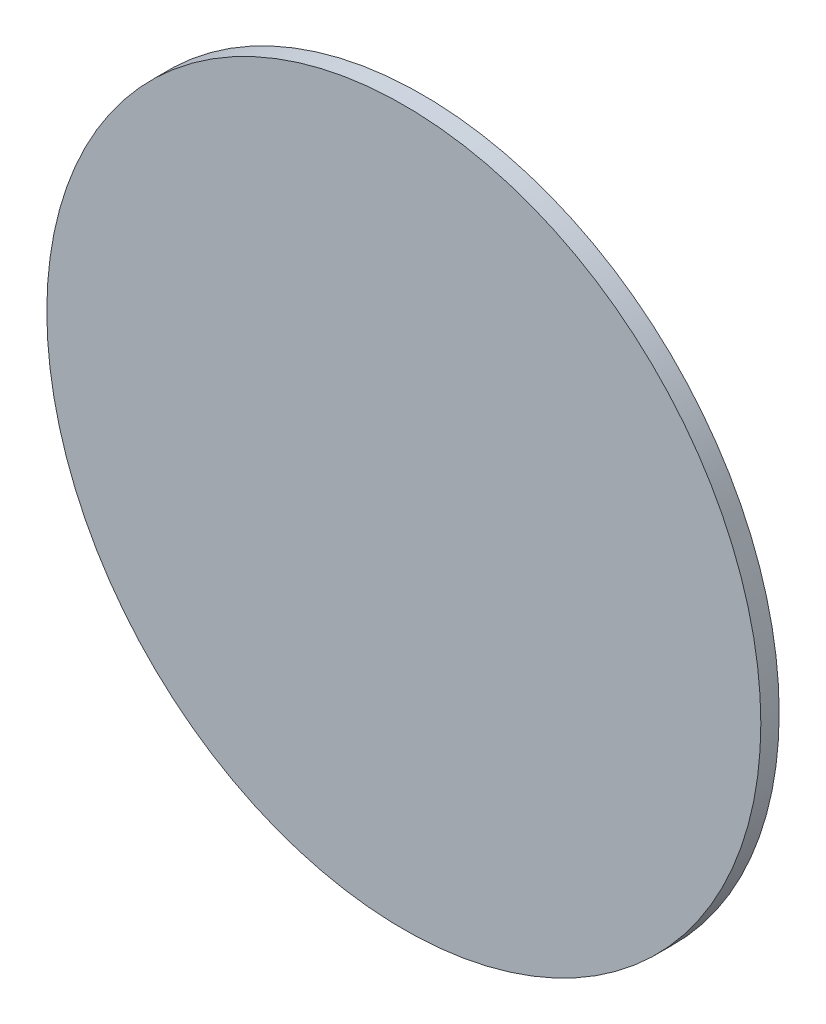
ISO-10303-21;
HEADER;
FILE_DESCRIPTION(('STEP AP214'),'2;1');
FILE_NAME('part.step','',(''),(''),'','','');
FILE_SCHEMA(('AUTOMOTIVE_DESIGN { 1 0 10303 214 1 1 1 1 }'));
ENDSEC;
DATA;
#1=APPLICATION_CONTEXT('core data for automotive mechanical design processes');
#2=APPLICATION_PROTOCOL_DEFINITION('international standard','automotive_design',2000,#1);
#3=PRODUCT_CONTEXT('',#1,'mechanical');
#4=PRODUCT('Part','Part','',(#3));
#5=PRODUCT_RELATED_PRODUCT_CATEGORY('part','',(#4));
#6=PRODUCT_DEFINITION_FORMATION('','',#4);
#7=PRODUCT_DEFINITION_CONTEXT('part definition',#1,'design');
#8=PRODUCT_DEFINITION('design','',#6,#7);
#9=PRODUCT_DEFINITION_SHAPE('','',#8);
#10=(LENGTH_UNIT() NAMED_UNIT(*) SI_UNIT(.MILLI.,.METRE.));
#11=(NAMED_UNIT(*) PLANE_ANGLE_UNIT() SI_UNIT($,.RADIAN.));
#12=(NAMED_UNIT(*) SI_UNIT($,.STERADIAN.) SOLID_ANGLE_UNIT());
#13=UNCERTAINTY_MEASURE_WITH_UNIT(LENGTH_MEASURE(1.E-05),#10,'distance_accuracy_value','');
#14=(GEOMETRIC_REPRESENTATION_CONTEXT(3) GLOBAL_UNCERTAINTY_ASSIGNED_CONTEXT((#13)) GLOBAL_UNIT_ASSIGNED_CONTEXT((#10,
#11,#12)) REPRESENTATION_CONTEXT('',''));
#15=CARTESIAN_POINT('',(0.,0.,0.));
#16=DIRECTION('',(0.,0.,1.));
#17=DIRECTION('',(1.,0.,0.));
#18=AXIS2_PLACEMENT_3D('',#15,#16,#17);
#19=CARTESIAN_POINT('',(0.,0.,-1.));
#20=DIRECTION('',(0.,0.,1.));
#21=DIRECTION('',(1.,0.,0.));
#22=AXIS2_PLACEMENT_3D('',#19,#20,#21);
#23=CYLINDRICAL_SURFACE('',#22,19.4583912911865);
#24=CARTESIAN_POINT('',(0.,0.,-1.));
#25=DIRECTION('',(0.,0.,1.));
#26=DIRECTION('',(1.,0.,0.));
#27=AXIS2_PLACEMENT_3D('',#24,#25,#26);
#28=CIRCLE('',#27,19.4583912911865);
#29=CARTESIAN_POINT('',(19.4583912911865,0.,-1.));
#30=VERTEX_POINT('',#29);
#31=EDGE_CURVE('E11',#30,#30,#28,.T.);
#32=ORIENTED_EDGE('',*,*,#31,.T.);
#33=EDGE_LOOP('',(#32));
#34=FACE_BOUND('',#33,.T.);
#35=CARTESIAN_POINT('',(0.,0.,0.));
#36=DIRECTION('',(0.,0.,1.));
#37=DIRECTION('',(1.,0.,0.));
#38=AXIS2_PLACEMENT_3D('',#35,#36,#37);
#39=CIRCLE('',#38,19.4583912911865);
#40=CARTESIAN_POINT('',(19.4583912911865,0.,0.));
#41=VERTEX_POINT('',#40);
#42=EDGE_CURVE('E39',#41,#41,#39,.T.);
#43=ORIENTED_EDGE('',*,*,#42,.F.);
#44=EDGE_LOOP('',(#43));
#45=FACE_BOUND('',#44,.T.);
#46=ADVANCED_FACE('F36',(#34,#45),#23,.T.);
#47=CARTESIAN_POINT('',(0.,0.,-1.));
#48=DIRECTION('',(0.,0.,1.));
#49=DIRECTION('',(1.,0.,0.));
#50=AXIS2_PLACEMENT_3D('',#47,#48,#49);
#51=PLANE('',#50);
#52=ORIENTED_EDGE('',*,*,#31,.F.);
#53=EDGE_LOOP('',(#52));
#54=FACE_BOUND('',#53,.T.);
#55=ADVANCED_FACE('F53',(#54),#51,.F.);
#56=CARTESIAN_POINT('',(0.,0.,0.));
#57=DIRECTION('',(0.,0.,1.));
#58=DIRECTION('',(1.,0.,0.));
#59=AXIS2_PLACEMENT_3D('',#56,#57,#58);
#60=PLANE('',#59);
#61=ORIENTED_EDGE('',*,*,#42,.T.);
#62=EDGE_LOOP('',(#61));
#63=FACE_BOUND('',#62,.T.);
#64=ADVANCED_FACE('F50',(#63),#60,.T.);
#65=CLOSED_SHELL('',(#46,#55,#64));
#66=MANIFOLD_SOLID_BREP('B2',#65);
#67=ADVANCED_BREP_SHAPE_REPRESENTATION('',(#18,#66),#14);
#68=SHAPE_DEFINITION_REPRESENTATION(#9,#67);
ENDSEC;
END-ISO-10303-21;
